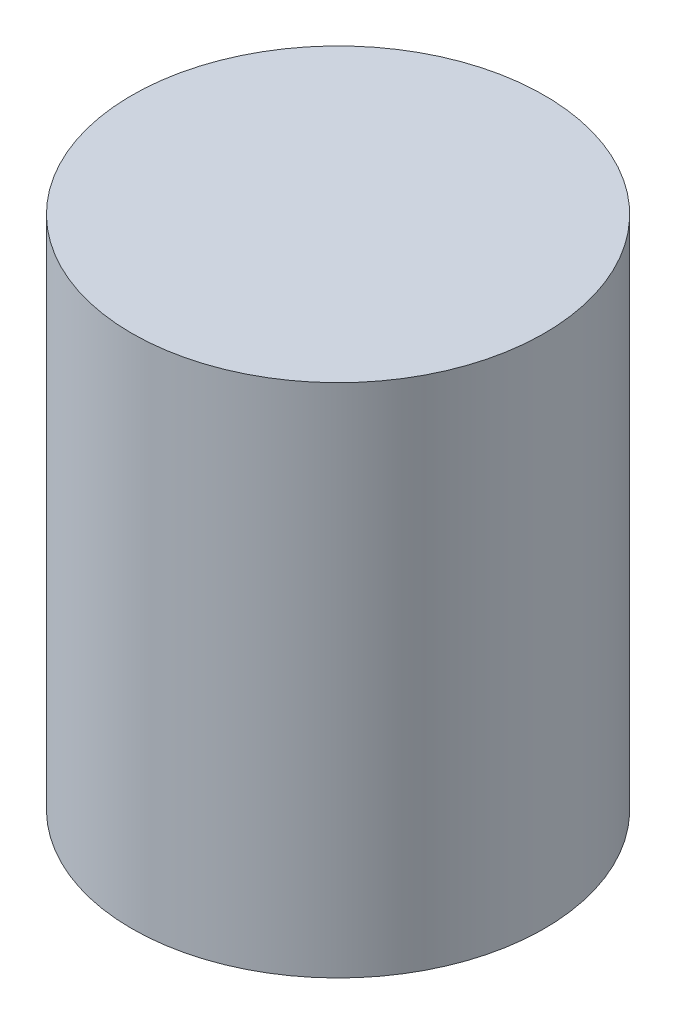
ISO-10303-21;
HEADER;
FILE_DESCRIPTION(('STEP AP214'),'2;1');
FILE_NAME('part.step','',(''),(''),'','','');
FILE_SCHEMA(('AUTOMOTIVE_DESIGN { 1 0 10303 214 1 1 1 1 }'));
ENDSEC;
DATA;
#1=APPLICATION_CONTEXT('core data for automotive mechanical design processes');
#2=APPLICATION_PROTOCOL_DEFINITION('international standard','automotive_design',2000,#1);
#3=PRODUCT_CONTEXT('',#1,'mechanical');
#4=PRODUCT('Part','Part','',(#3));
#5=PRODUCT_RELATED_PRODUCT_CATEGORY('part','',(#4));
#6=PRODUCT_DEFINITION_FORMATION('','',#4);
#7=PRODUCT_DEFINITION_CONTEXT('part definition',#1,'design');
#8=PRODUCT_DEFINITION('design','',#6,#7);
#9=PRODUCT_DEFINITION_SHAPE('','',#8);
#10=(LENGTH_UNIT() NAMED_UNIT(*) SI_UNIT(.MILLI.,.METRE.));
#11=(NAMED_UNIT(*) PLANE_ANGLE_UNIT() SI_UNIT($,.RADIAN.));
#12=(NAMED_UNIT(*) SI_UNIT($,.STERADIAN.) SOLID_ANGLE_UNIT());
#13=UNCERTAINTY_MEASURE_WITH_UNIT(LENGTH_MEASURE(1.E-05),#10,'distance_accuracy_value','');
#14=(GEOMETRIC_REPRESENTATION_CONTEXT(3) GLOBAL_UNCERTAINTY_ASSIGNED_CONTEXT((#13)) GLOBAL_UNIT_ASSIGNED_CONTEXT((#10,
#11,#12)) REPRESENTATION_CONTEXT('',''));
#15=CARTESIAN_POINT('',(0.,0.,0.));
#16=DIRECTION('',(0.,0.,1.));
#17=DIRECTION('',(1.,0.,0.));
#18=AXIS2_PLACEMENT_3D('',#15,#16,#17);
#19=CARTESIAN_POINT('',(0.,100.,0.));
#20=DIRECTION('',(0.,-1.,0.));
#21=DIRECTION('',(0.,0.,-1.));
#22=AXIS2_PLACEMENT_3D('',#19,#20,#21);
#23=CYLINDRICAL_SURFACE('',#22,40.);
#24=CARTESIAN_POINT('',(0.,100.,0.));
#25=DIRECTION('',(0.,1.,0.));
#26=DIRECTION('',(0.,0.,1.));
#27=AXIS2_PLACEMENT_3D('',#24,#25,#26);
#28=CIRCLE('',#27,40.);
#29=CARTESIAN_POINT('',(0.,100.,40.));
#30=VERTEX_POINT('',#29);
#31=EDGE_CURVE('E10',#30,#30,#28,.T.);
#32=ORIENTED_EDGE('',*,*,#31,.F.);
#33=EDGE_LOOP('',(#32));
#34=FACE_BOUND('',#33,.T.);
#35=CARTESIAN_POINT('',(0.,0.,0.));
#36=DIRECTION('',(0.,1.,0.));
#37=DIRECTION('',(0.,0.,1.));
#38=AXIS2_PLACEMENT_3D('',#35,#36,#37);
#39=CIRCLE('',#38,40.);
#40=CARTESIAN_POINT('',(0.,0.,40.));
#41=VERTEX_POINT('',#40);
#42=EDGE_CURVE('E46',#41,#41,#39,.T.);
#43=ORIENTED_EDGE('',*,*,#42,.T.);
#44=EDGE_LOOP('',(#43));
#45=FACE_BOUND('',#44,.T.);
#46=ADVANCED_FACE('F43',(#34,#45),#23,.T.);
#47=CARTESIAN_POINT('',(0.,100.,0.));
#48=DIRECTION('',(0.,1.,0.));
#49=DIRECTION('',(0.,0.,1.));
#50=AXIS2_PLACEMENT_3D('',#47,#48,#49);
#51=PLANE('',#50);
#52=ORIENTED_EDGE('',*,*,#31,.T.);
#53=EDGE_LOOP('',(#52));
#54=FACE_BOUND('',#53,.T.);
#55=ADVANCED_FACE('F87',(#54),#51,.T.);
#56=CARTESIAN_POINT('',(0.,0.,0.));
#57=DIRECTION('',(0.,1.,0.));
#58=DIRECTION('',(0.,0.,1.));
#59=AXIS2_PLACEMENT_3D('',#56,#57,#58);
#60=PLANE('',#59);
#61=CARTESIAN_POINT('',(0.,0.,-22.));
#62=DIRECTION('',(0.,-1.,0.));
#63=DIRECTION('',(0.,0.,-1.));
#64=AXIS2_PLACEMENT_3D('',#61,#62,#63);
#65=CIRCLE('',#64,5.);
#66=CARTESIAN_POINT('',(0.,0.,-27.));
#67=VERTEX_POINT('',#66);
#68=EDGE_CURVE('E69',#67,#67,#65,.T.);
#69=ORIENTED_EDGE('',*,*,#68,.F.);
#70=EDGE_LOOP('',(#69));
#71=FACE_BOUND('',#70,.T.);
#72=CARTESIAN_POINT('',(0.,0.,22.));
#73=DIRECTION('',(0.,-1.,0.));
#74=DIRECTION('',(0.,0.,-1.));
#75=AXIS2_PLACEMENT_3D('',#72,#73,#74);
#76=CIRCLE('',#75,5.);
#77=CARTESIAN_POINT('',(0.,0.,17.));
#78=VERTEX_POINT('',#77);
#79=EDGE_CURVE('E61',#78,#78,#76,.T.);
#80=ORIENTED_EDGE('',*,*,#79,.F.);
#81=EDGE_LOOP('',(#80));
#82=FACE_BOUND('',#81,.T.);
#83=CARTESIAN_POINT('',(0.,0.,0.));
#84=DIRECTION('',(0.,-1.,0.));
#85=DIRECTION('',(0.,0.,-1.));
#86=AXIS2_PLACEMENT_3D('',#83,#84,#85);
#87=CIRCLE('',#86,10.);
#88=CARTESIAN_POINT('',(0.,0.,-10.));
#89=VERTEX_POINT('',#88);
#90=EDGE_CURVE('E57',#89,#89,#87,.T.);
#91=ORIENTED_EDGE('',*,*,#90,.F.);
#92=EDGE_LOOP('',(#91));
#93=FACE_BOUND('',#92,.T.);
#94=ORIENTED_EDGE('',*,*,#42,.F.);
#95=EDGE_LOOP('',(#94));
#96=FACE_BOUND('',#95,.T.);
#97=ADVANCED_FACE('F83',(#71,#82,#93,#96),#60,.F.);
#98=CARTESIAN_POINT('',(0.,20.,0.));
#99=DIRECTION('',(0.,-1.,0.));
#100=DIRECTION('',(0.,0.,-1.));
#101=AXIS2_PLACEMENT_3D('',#98,#99,#100);
#102=CYLINDRICAL_SURFACE('',#101,10.);
#103=CARTESIAN_POINT('',(0.,20.,0.));
#104=DIRECTION('',(0.,-1.,0.));
#105=DIRECTION('',(0.,0.,-1.));
#106=AXIS2_PLACEMENT_3D('',#103,#104,#105);
#107=CIRCLE('',#106,10.);
#108=CARTESIAN_POINT('',(0.,20.,-10.));
#109=VERTEX_POINT('',#108);
#110=EDGE_CURVE('E55',#109,#109,#107,.T.);
#111=ORIENTED_EDGE('',*,*,#110,.F.);
#112=EDGE_LOOP('',(#111));
#113=FACE_BOUND('',#112,.T.);
#114=ORIENTED_EDGE('',*,*,#90,.T.);
#115=EDGE_LOOP('',(#114));
#116=FACE_BOUND('',#115,.T.);
#117=ADVANCED_FACE('F86',(#113,#116),#102,.F.);
#118=CARTESIAN_POINT('',(0.,20.,0.));
#119=DIRECTION('',(0.,-1.,0.));
#120=DIRECTION('',(0.,0.,-1.));
#121=AXIS2_PLACEMENT_3D('',#118,#119,#120);
#122=PLANE('',#121);
#123=ORIENTED_EDGE('',*,*,#110,.T.);
#124=EDGE_LOOP('',(#123));
#125=FACE_BOUND('',#124,.T.);
#126=ADVANCED_FACE('F104',(#125),#122,.T.);
#127=CARTESIAN_POINT('',(0.,20.,22.));
#128=DIRECTION('',(0.,-1.,0.));
#129=DIRECTION('',(0.,0.,-1.));
#130=AXIS2_PLACEMENT_3D('',#127,#128,#129);
#131=CYLINDRICAL_SURFACE('',#130,5.);
#132=CARTESIAN_POINT('',(0.,20.,22.));
#133=DIRECTION('',(0.,-1.,0.));
#134=DIRECTION('',(0.,0.,-1.));
#135=AXIS2_PLACEMENT_3D('',#132,#133,#134);
#136=CIRCLE('',#135,5.);
#137=CARTESIAN_POINT('',(0.,20.,17.));
#138=VERTEX_POINT('',#137);
#139=EDGE_CURVE('E73',#138,#138,#136,.T.);
#140=ORIENTED_EDGE('',*,*,#139,.F.);
#141=EDGE_LOOP('',(#140));
#142=FACE_BOUND('',#141,.T.);
#143=ORIENTED_EDGE('',*,*,#79,.T.);
#144=EDGE_LOOP('',(#143));
#145=FACE_BOUND('',#144,.T.);
#146=ADVANCED_FACE('F81',(#142,#145),#131,.F.);
#147=CARTESIAN_POINT('',(0.,20.,22.));
#148=DIRECTION('',(0.,-1.,0.));
#149=DIRECTION('',(0.,0.,-1.));
#150=AXIS2_PLACEMENT_3D('',#147,#148,#149);
#151=PLANE('',#150);
#152=ORIENTED_EDGE('',*,*,#139,.T.);
#153=EDGE_LOOP('',(#152));
#154=FACE_BOUND('',#153,.T.);
#155=ADVANCED_FACE('F116',(#154),#151,.T.);
#156=CARTESIAN_POINT('',(0.,20.,-22.));
#157=DIRECTION('',(0.,-1.,0.));
#158=DIRECTION('',(0.,0.,-1.));
#159=AXIS2_PLACEMENT_3D('',#156,#157,#158);
#160=CYLINDRICAL_SURFACE('',#159,5.);
#161=CARTESIAN_POINT('',(0.,20.,-22.));
#162=DIRECTION('',(0.,-1.,0.));
#163=DIRECTION('',(0.,0.,-1.));
#164=AXIS2_PLACEMENT_3D('',#161,#162,#163);
#165=CIRCLE('',#164,5.);
#166=CARTESIAN_POINT('',(0.,20.,-27.));
#167=VERTEX_POINT('',#166);
#168=EDGE_CURVE('E65',#167,#167,#165,.T.);
#169=ORIENTED_EDGE('',*,*,#168,.F.);
#170=EDGE_LOOP('',(#169));
#171=FACE_BOUND('',#170,.T.);
#172=ORIENTED_EDGE('',*,*,#68,.T.);
#173=EDGE_LOOP('',(#172));
#174=FACE_BOUND('',#173,.T.);
#175=ADVANCED_FACE('F112',(#171,#174),#160,.F.);
#176=CARTESIAN_POINT('',(0.,20.,-22.));
#177=DIRECTION('',(0.,-1.,0.));
#178=DIRECTION('',(0.,0.,-1.));
#179=AXIS2_PLACEMENT_3D('',#176,#177,#178);
#180=PLANE('',#179);
#181=ORIENTED_EDGE('',*,*,#168,.T.);
#182=EDGE_LOOP('',(#181));
#183=FACE_BOUND('',#182,.T.);
#184=ADVANCED_FACE('F109',(#183),#180,.T.);
#185=CLOSED_SHELL('',(#46,#55,#97,#117,#126,#146,#155,#175,#184));
#186=MANIFOLD_SOLID_BREP('B2',#185);
#187=ADVANCED_BREP_SHAPE_REPRESENTATION('',(#18,#186),#14);
#188=SHAPE_DEFINITION_REPRESENTATION(#9,#187);
ENDSEC;
END-ISO-10303-21;
